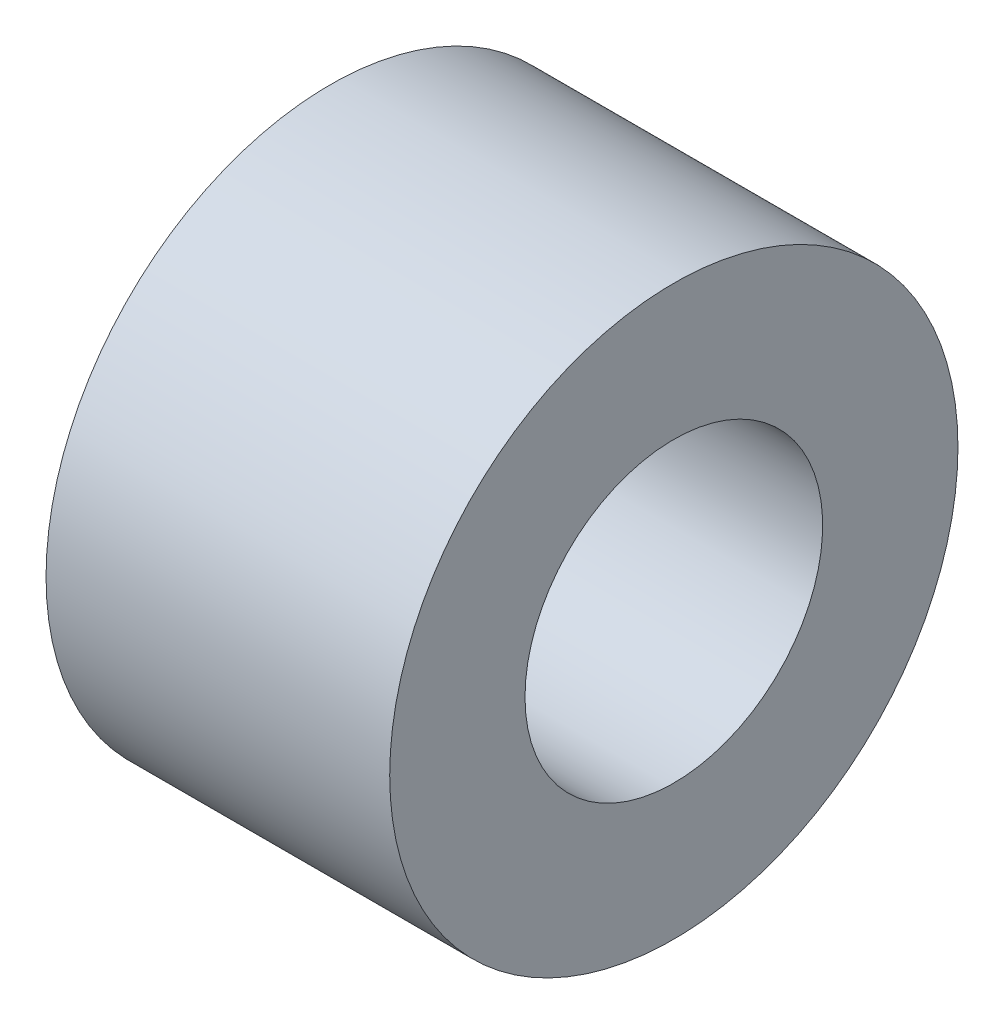
ISO-10303-21;
HEADER;
FILE_DESCRIPTION(('STEP AP214'),'2;1');
FILE_NAME('part.step','',(''),(''),'','','');
FILE_SCHEMA(('AUTOMOTIVE_DESIGN { 1 0 10303 214 1 1 1 1 }'));
ENDSEC;
DATA;
#1=APPLICATION_CONTEXT('core data for automotive mechanical design processes');
#2=APPLICATION_PROTOCOL_DEFINITION('international standard','automotive_design',2000,#1);
#3=PRODUCT_CONTEXT('',#1,'mechanical');
#4=PRODUCT('Part','Part','',(#3));
#5=PRODUCT_RELATED_PRODUCT_CATEGORY('part','',(#4));
#6=PRODUCT_DEFINITION_FORMATION('','',#4);
#7=PRODUCT_DEFINITION_CONTEXT('part definition',#1,'design');
#8=PRODUCT_DEFINITION('design','',#6,#7);
#9=PRODUCT_DEFINITION_SHAPE('','',#8);
#10=(LENGTH_UNIT() NAMED_UNIT(*) SI_UNIT(.MILLI.,.METRE.));
#11=(NAMED_UNIT(*) PLANE_ANGLE_UNIT() SI_UNIT($,.RADIAN.));
#12=(NAMED_UNIT(*) SI_UNIT($,.STERADIAN.) SOLID_ANGLE_UNIT());
#13=UNCERTAINTY_MEASURE_WITH_UNIT(LENGTH_MEASURE(1.E-05),#10,'distance_accuracy_value','');
#14=(GEOMETRIC_REPRESENTATION_CONTEXT(3) GLOBAL_UNCERTAINTY_ASSIGNED_CONTEXT((#13)) GLOBAL_UNIT_ASSIGNED_CONTEXT((#10,
#11,#12)) REPRESENTATION_CONTEXT('',''));
#15=CARTESIAN_POINT('',(0.,0.,0.));
#16=DIRECTION('',(0.,0.,1.));
#17=DIRECTION('',(1.,0.,0.));
#18=AXIS2_PLACEMENT_3D('',#15,#16,#17);
#19=CARTESIAN_POINT('',(-12.7,21.,0.));
#20=DIRECTION('',(1.,0.,0.));
#21=DIRECTION('',(0.,0.,-1.));
#22=AXIS2_PLACEMENT_3D('',#19,#20,#21);
#23=PLANE('',#22);
#24=CARTESIAN_POINT('',(-12.7,0.,0.));
#25=DIRECTION('',(-1.,0.,0.));
#26=DIRECTION('',(0.,0.,1.));
#27=AXIS2_PLACEMENT_3D('',#24,#25,#26);
#28=CIRCLE('',#27,11.);
#29=CARTESIAN_POINT('',(-12.7,0.,11.));
#30=VERTEX_POINT('',#29);
#31=EDGE_CURVE('E10',#30,#30,#28,.T.);
#32=ORIENTED_EDGE('',*,*,#31,.F.);
#33=EDGE_LOOP('',(#32));
#34=FACE_BOUND('',#33,.T.);
#35=CARTESIAN_POINT('',(-12.7,0.,0.));
#36=DIRECTION('',(-1.,0.,0.));
#37=DIRECTION('',(0.,0.,1.));
#38=AXIS2_PLACEMENT_3D('',#35,#36,#37);
#39=CIRCLE('',#38,21.);
#40=CARTESIAN_POINT('',(-12.7,0.,21.));
#41=VERTEX_POINT('',#40);
#42=EDGE_CURVE('E44',#41,#41,#39,.T.);
#43=ORIENTED_EDGE('',*,*,#42,.T.);
#44=EDGE_LOOP('',(#43));
#45=FACE_BOUND('',#44,.T.);
#46=ADVANCED_FACE('F30',(#34,#45),#23,.F.);
#47=CARTESIAN_POINT('',(-32.3193135591661,0.,0.));
#48=DIRECTION('',(-1.,0.,0.));
#49=DIRECTION('',(0.,0.,1.));
#50=AXIS2_PLACEMENT_3D('',#47,#48,#49);
#51=CYLINDRICAL_SURFACE('',#50,11.);
#52=CARTESIAN_POINT('',(12.7,0.,0.));
#53=DIRECTION('',(-1.,0.,0.));
#54=DIRECTION('',(0.,0.,1.));
#55=AXIS2_PLACEMENT_3D('',#52,#53,#54);
#56=CIRCLE('',#55,11.);
#57=CARTESIAN_POINT('',(12.7,0.,11.));
#58=VERTEX_POINT('',#57);
#59=EDGE_CURVE('E36',#58,#58,#56,.T.);
#60=ORIENTED_EDGE('',*,*,#59,.F.);
#61=EDGE_LOOP('',(#60));
#62=FACE_BOUND('',#61,.T.);
#63=ORIENTED_EDGE('',*,*,#31,.T.);
#64=EDGE_LOOP('',(#63));
#65=FACE_BOUND('',#64,.T.);
#66=ADVANCED_FACE('F59',(#62,#65),#51,.F.);
#67=CARTESIAN_POINT('',(12.7,21.,0.));
#68=DIRECTION('',(-1.,0.,0.));
#69=DIRECTION('',(0.,0.,1.));
#70=AXIS2_PLACEMENT_3D('',#67,#68,#69);
#71=PLANE('',#70);
#72=CARTESIAN_POINT('',(12.7,0.,0.));
#73=DIRECTION('',(-1.,0.,0.));
#74=DIRECTION('',(0.,0.,1.));
#75=AXIS2_PLACEMENT_3D('',#72,#73,#74);
#76=CIRCLE('',#75,21.);
#77=CARTESIAN_POINT('',(12.7,0.,21.));
#78=VERTEX_POINT('',#77);
#79=EDGE_CURVE('E40',#78,#78,#76,.T.);
#80=ORIENTED_EDGE('',*,*,#79,.F.);
#81=EDGE_LOOP('',(#80));
#82=FACE_BOUND('',#81,.T.);
#83=ORIENTED_EDGE('',*,*,#59,.T.);
#84=EDGE_LOOP('',(#83));
#85=FACE_BOUND('',#84,.T.);
#86=ADVANCED_FACE('F54',(#82,#85),#71,.F.);
#87=CARTESIAN_POINT('',(-32.3193135591661,0.,0.));
#88=DIRECTION('',(-1.,0.,0.));
#89=DIRECTION('',(0.,0.,1.));
#90=AXIS2_PLACEMENT_3D('',#87,#88,#89);
#91=CYLINDRICAL_SURFACE('',#90,21.);
#92=ORIENTED_EDGE('',*,*,#42,.F.);
#93=EDGE_LOOP('',(#92));
#94=FACE_BOUND('',#93,.T.);
#95=ORIENTED_EDGE('',*,*,#79,.T.);
#96=EDGE_LOOP('',(#95));
#97=FACE_BOUND('',#96,.T.);
#98=ADVANCED_FACE('F51',(#94,#97),#91,.T.);
#99=CLOSED_SHELL('',(#46,#66,#86,#98));
#100=MANIFOLD_SOLID_BREP('B2',#99);
#101=ADVANCED_BREP_SHAPE_REPRESENTATION('',(#18,#100),#14);
#102=SHAPE_DEFINITION_REPRESENTATION(#9,#101);
ENDSEC;
END-ISO-10303-21;
